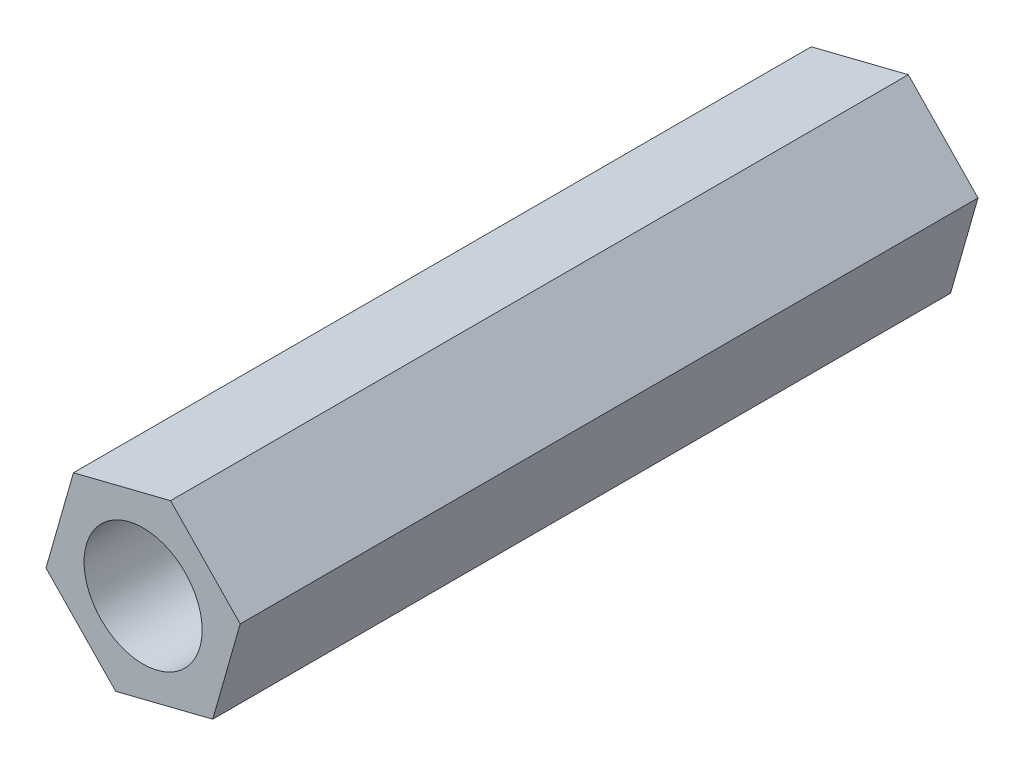
ISO-10303-21;
HEADER;
FILE_DESCRIPTION(('STEP AP214'),'2;1');
FILE_NAME('part.step','',(''),(''),'','','');
FILE_SCHEMA(('AUTOMOTIVE_DESIGN { 1 0 10303 214 1 1 1 1 }'));
ENDSEC;
DATA;
#1=APPLICATION_CONTEXT('core data for automotive mechanical design processes');
#2=APPLICATION_PROTOCOL_DEFINITION('international standard','automotive_design',2000,#1);
#3=PRODUCT_CONTEXT('',#1,'mechanical');
#4=PRODUCT('Part','Part','',(#3));
#5=PRODUCT_RELATED_PRODUCT_CATEGORY('part','',(#4));
#6=PRODUCT_DEFINITION_FORMATION('','',#4);
#7=PRODUCT_DEFINITION_CONTEXT('part definition',#1,'design');
#8=PRODUCT_DEFINITION('design','',#6,#7);
#9=PRODUCT_DEFINITION_SHAPE('','',#8);
#10=(LENGTH_UNIT() NAMED_UNIT(*) SI_UNIT(.MILLI.,.METRE.));
#11=(NAMED_UNIT(*) PLANE_ANGLE_UNIT() SI_UNIT($,.RADIAN.));
#12=(NAMED_UNIT(*) SI_UNIT($,.STERADIAN.) SOLID_ANGLE_UNIT());
#13=UNCERTAINTY_MEASURE_WITH_UNIT(LENGTH_MEASURE(1.E-05),#10,'distance_accuracy_value','');
#14=(GEOMETRIC_REPRESENTATION_CONTEXT(3) GLOBAL_UNCERTAINTY_ASSIGNED_CONTEXT((#13)) GLOBAL_UNIT_ASSIGNED_CONTEXT((#10,
#11,#12)) REPRESENTATION_CONTEXT('',''));
#15=CARTESIAN_POINT('',(0.,0.,0.));
#16=DIRECTION('',(0.,0.,1.));
#17=DIRECTION('',(1.,0.,0.));
#18=AXIS2_PLACEMENT_3D('',#15,#16,#17);
#19=CARTESIAN_POINT('',(0.,0.,20.));
#20=DIRECTION('',(0.,0.,1.));
#21=DIRECTION('',(1.,0.,0.));
#22=AXIS2_PLACEMENT_3D('',#19,#20,#21);
#23=PLANE('',#22);
#24=DIRECTION('',(0.969936568175344,0.243357871695649,0.));
#25=VECTOR('',#24,1.);
#26=CARTESIAN_POINT('',(-0.744092877537531,-2.60953235713437,20.));
#27=LINE('',#26,#25);
#28=CARTESIAN_POINT('',(-0.744092877537531,-2.60953235713437,20.));
#29=VERTEX_POINT('',#28);
#30=CARTESIAN_POINT('',(1.88787487450708,-1.94916951328975,20.));
#31=VERTEX_POINT('',#30);
#32=EDGE_CURVE('E129',#29,#31,#27,.T.);
#33=ORIENTED_EDGE('',*,*,#32,.T.);
#34=DIRECTION('',(0.274214184988325,0.96166864394717,0.));
#35=VECTOR('',#34,1.);
#36=CARTESIAN_POINT('',(1.88787487450708,-1.94916951328975,20.));
#37=LINE('',#36,#35);
#38=CARTESIAN_POINT('',(2.63196775204461,0.660362843844619,20.));
#39=VERTEX_POINT('',#38);
#40=EDGE_CURVE('E87',#31,#39,#37,.T.);
#41=ORIENTED_EDGE('',*,*,#40,.T.);
#42=DIRECTION('',(-0.695722383187018,0.71831077225152,0.));
#43=VECTOR('',#42,1.);
#44=CARTESIAN_POINT('',(2.63196775204461,0.660362843844619,20.));
#45=LINE('',#44,#43);
#46=CARTESIAN_POINT('',(0.744092877537532,2.60953235713437,20.));
#47=VERTEX_POINT('',#46);
#48=EDGE_CURVE('E100',#39,#47,#45,.T.);
#49=ORIENTED_EDGE('',*,*,#48,.T.);
#50=DIRECTION('',(-0.969936568175344,-0.243357871695649,0.));
#51=VECTOR('',#50,1.);
#52=CARTESIAN_POINT('',(0.744092877537532,2.60953235713437,20.));
#53=LINE('',#52,#51);
#54=CARTESIAN_POINT('',(-1.88787487450708,1.94916951328975,20.));
#55=VERTEX_POINT('',#54);
#56=EDGE_CURVE('E94',#47,#55,#53,.T.);
#57=ORIENTED_EDGE('',*,*,#56,.T.);
#58=DIRECTION('',(-0.274214184988326,-0.96166864394717,0.));
#59=VECTOR('',#58,1.);
#60=CARTESIAN_POINT('',(-1.88787487450708,1.94916951328975,20.));
#61=LINE('',#60,#59);
#62=CARTESIAN_POINT('',(-2.63196775204461,-0.660362843844618,20.));
#63=VERTEX_POINT('',#62);
#64=EDGE_CURVE('E98',#55,#63,#61,.T.);
#65=ORIENTED_EDGE('',*,*,#64,.T.);
#66=DIRECTION('',(0.695722383187018,-0.718310772251521,0.));
#67=VECTOR('',#66,1.);
#68=CARTESIAN_POINT('',(-2.63196775204461,-0.660362843844618,20.));
#69=LINE('',#68,#67);
#70=EDGE_CURVE('E50',#63,#29,#69,.T.);
#71=ORIENTED_EDGE('',*,*,#70,.T.);
#72=EDGE_LOOP('',(#33,#41,#49,#57,#65,#71));
#73=FACE_BOUND('',#72,.T.);
#74=CARTESIAN_POINT('',(0.,0.,20.));
#75=DIRECTION('',(0.,0.,1.));
#76=DIRECTION('',(1.,0.,0.));
#77=AXIS2_PLACEMENT_3D('',#74,#75,#76);
#78=CIRCLE('',#77,1.6);
#79=CARTESIAN_POINT('',(1.6,0.,20.));
#80=VERTEX_POINT('',#79);
#81=EDGE_CURVE('E122',#80,#80,#78,.T.);
#82=ORIENTED_EDGE('',*,*,#81,.F.);
#83=EDGE_LOOP('',(#82));
#84=FACE_BOUND('',#83,.T.);
#85=ADVANCED_FACE('F33',(#73,#84),#23,.T.);
#86=CARTESIAN_POINT('',(0.,0.,0.));
#87=DIRECTION('',(0.,0.,1.));
#88=DIRECTION('',(1.,0.,0.));
#89=AXIS2_PLACEMENT_3D('',#86,#87,#88);
#90=PLANE('',#89);
#91=DIRECTION('',(0.969936568175344,0.243357871695649,0.));
#92=VECTOR('',#91,1.);
#93=CARTESIAN_POINT('',(-0.744092877537531,-2.60953235713437,0.));
#94=LINE('',#93,#92);
#95=CARTESIAN_POINT('',(-0.744092877537531,-2.60953235713437,0.));
#96=VERTEX_POINT('',#95);
#97=CARTESIAN_POINT('',(1.88787487450708,-1.94916951328975,0.));
#98=VERTEX_POINT('',#97);
#99=EDGE_CURVE('E118',#96,#98,#94,.T.);
#100=ORIENTED_EDGE('',*,*,#99,.F.);
#101=DIRECTION('',(0.695722383187018,-0.718310772251521,0.));
#102=VECTOR('',#101,1.);
#103=CARTESIAN_POINT('',(-2.63196775204461,-0.660362843844618,0.));
#104=LINE('',#103,#102);
#105=CARTESIAN_POINT('',(-2.63196775204461,-0.660362843844618,0.));
#106=VERTEX_POINT('',#105);
#107=EDGE_CURVE('E79',#106,#96,#104,.T.);
#108=ORIENTED_EDGE('',*,*,#107,.F.);
#109=DIRECTION('',(-0.274214184988326,-0.96166864394717,0.));
#110=VECTOR('',#109,1.);
#111=CARTESIAN_POINT('',(-1.88787487450708,1.94916951328975,0.));
#112=LINE('',#111,#110);
#113=CARTESIAN_POINT('',(-1.88787487450708,1.94916951328975,0.));
#114=VERTEX_POINT('',#113);
#115=EDGE_CURVE('E73',#114,#106,#112,.T.);
#116=ORIENTED_EDGE('',*,*,#115,.F.);
#117=DIRECTION('',(-0.969936568175344,-0.243357871695649,0.));
#118=VECTOR('',#117,1.);
#119=CARTESIAN_POINT('',(0.744092877537532,2.60953235713437,0.));
#120=LINE('',#119,#118);
#121=CARTESIAN_POINT('',(0.744092877537532,2.60953235713437,0.));
#122=VERTEX_POINT('',#121);
#123=EDGE_CURVE('E108',#122,#114,#120,.T.);
#124=ORIENTED_EDGE('',*,*,#123,.F.);
#125=DIRECTION('',(-0.695722383187018,0.71831077225152,0.));
#126=VECTOR('',#125,1.);
#127=CARTESIAN_POINT('',(2.63196775204461,0.660362843844619,0.));
#128=LINE('',#127,#126);
#129=CARTESIAN_POINT('',(2.63196775204461,0.660362843844619,0.));
#130=VERTEX_POINT('',#129);
#131=EDGE_CURVE('E124',#130,#122,#128,.T.);
#132=ORIENTED_EDGE('',*,*,#131,.F.);
#133=DIRECTION('',(0.274214184988325,0.96166864394717,0.));
#134=VECTOR('',#133,1.);
#135=CARTESIAN_POINT('',(1.88787487450708,-1.94916951328975,0.));
#136=LINE('',#135,#134);
#137=EDGE_CURVE('E121',#98,#130,#136,.T.);
#138=ORIENTED_EDGE('',*,*,#137,.F.);
#139=EDGE_LOOP('',(#100,#108,#116,#124,#132,#138));
#140=FACE_BOUND('',#139,.T.);
#141=CARTESIAN_POINT('',(0.,0.,0.));
#142=DIRECTION('',(0.,0.,1.));
#143=DIRECTION('',(1.,0.,0.));
#144=AXIS2_PLACEMENT_3D('',#141,#142,#143);
#145=CIRCLE('',#144,1.6);
#146=CARTESIAN_POINT('',(1.6,0.,0.));
#147=VERTEX_POINT('',#146);
#148=EDGE_CURVE('E222',#147,#147,#145,.T.);
#149=ORIENTED_EDGE('',*,*,#148,.T.);
#150=EDGE_LOOP('',(#149));
#151=FACE_BOUND('',#150,.T.);
#152=ADVANCED_FACE('F138',(#140,#151),#90,.F.);
#153=CARTESIAN_POINT('',(-0.744092877537531,-2.60953235713437,20.));
#154=DIRECTION('',(-0.243357871695649,0.969936568175344,0.));
#155=DIRECTION('',(-0.969936568175344,-0.243357871695649,0.));
#156=AXIS2_PLACEMENT_3D('',#153,#154,#155);
#157=PLANE('',#156);
#158=ORIENTED_EDGE('',*,*,#99,.T.);
#159=DIRECTION('',(0.,0.,-1.));
#160=VECTOR('',#159,1.);
#161=CARTESIAN_POINT('',(1.88787487450708,-1.94916951328975,20.));
#162=LINE('',#161,#160);
#163=EDGE_CURVE('E11',#31,#98,#162,.T.);
#164=ORIENTED_EDGE('',*,*,#163,.F.);
#165=ORIENTED_EDGE('',*,*,#32,.F.);
#166=DIRECTION('',(0.,0.,-1.));
#167=VECTOR('',#166,1.);
#168=CARTESIAN_POINT('',(-0.744092877537531,-2.60953235713437,20.));
#169=LINE('',#168,#167);
#170=EDGE_CURVE('E114',#29,#96,#169,.T.);
#171=ORIENTED_EDGE('',*,*,#170,.T.);
#172=EDGE_LOOP('',(#158,#164,#165,#171));
#173=FACE_BOUND('',#172,.T.);
#174=ADVANCED_FACE('F35',(#173),#157,.F.);
#175=CARTESIAN_POINT('',(1.88787487450708,-1.94916951328975,20.));
#176=DIRECTION('',(-0.96166864394717,0.274214184988325,0.));
#177=DIRECTION('',(-0.274214184988325,-0.96166864394717,0.));
#178=AXIS2_PLACEMENT_3D('',#175,#176,#177);
#179=PLANE('',#178);
#180=ORIENTED_EDGE('',*,*,#137,.T.);
#181=DIRECTION('',(0.,0.,-1.));
#182=VECTOR('',#181,1.);
#183=CARTESIAN_POINT('',(2.63196775204461,0.660362843844619,20.));
#184=LINE('',#183,#182);
#185=EDGE_CURVE('E42',#39,#130,#184,.T.);
#186=ORIENTED_EDGE('',*,*,#185,.F.);
#187=ORIENTED_EDGE('',*,*,#40,.F.);
#188=ORIENTED_EDGE('',*,*,#163,.T.);
#189=EDGE_LOOP('',(#180,#186,#187,#188));
#190=FACE_BOUND('',#189,.T.);
#191=ADVANCED_FACE('F163',(#190),#179,.F.);
#192=CARTESIAN_POINT('',(2.63196775204461,0.660362843844619,20.));
#193=DIRECTION('',(-0.71831077225152,-0.695722383187018,0.));
#194=DIRECTION('',(0.695722383187018,-0.718310772251521,0.));
#195=AXIS2_PLACEMENT_3D('',#192,#193,#194);
#196=PLANE('',#195);
#197=ORIENTED_EDGE('',*,*,#131,.T.);
#198=DIRECTION('',(0.,0.,-1.));
#199=VECTOR('',#198,1.);
#200=CARTESIAN_POINT('',(0.744092877537532,2.60953235713437,20.));
#201=LINE('',#200,#199);
#202=EDGE_CURVE('E109',#47,#122,#201,.T.);
#203=ORIENTED_EDGE('',*,*,#202,.F.);
#204=ORIENTED_EDGE('',*,*,#48,.F.);
#205=ORIENTED_EDGE('',*,*,#185,.T.);
#206=EDGE_LOOP('',(#197,#203,#204,#205));
#207=FACE_BOUND('',#206,.T.);
#208=ADVANCED_FACE('F135',(#207),#196,.F.);
#209=CARTESIAN_POINT('',(0.744092877537532,2.60953235713437,20.));
#210=DIRECTION('',(0.243357871695649,-0.969936568175344,0.));
#211=DIRECTION('',(0.969936568175344,0.243357871695649,0.));
#212=AXIS2_PLACEMENT_3D('',#209,#210,#211);
#213=PLANE('',#212);
#214=ORIENTED_EDGE('',*,*,#123,.T.);
#215=DIRECTION('',(0.,0.,-1.));
#216=VECTOR('',#215,1.);
#217=CARTESIAN_POINT('',(-1.88787487450708,1.94916951328975,20.));
#218=LINE('',#217,#216);
#219=EDGE_CURVE('E105',#55,#114,#218,.T.);
#220=ORIENTED_EDGE('',*,*,#219,.F.);
#221=ORIENTED_EDGE('',*,*,#56,.F.);
#222=ORIENTED_EDGE('',*,*,#202,.T.);
#223=EDGE_LOOP('',(#214,#220,#221,#222));
#224=FACE_BOUND('',#223,.T.);
#225=ADVANCED_FACE('F106',(#224),#213,.F.);
#226=CARTESIAN_POINT('',(-1.88787487450708,1.94916951328975,20.));
#227=DIRECTION('',(0.96166864394717,-0.274214184988326,0.));
#228=DIRECTION('',(0.274214184988326,0.96166864394717,0.));
#229=AXIS2_PLACEMENT_3D('',#226,#227,#228);
#230=PLANE('',#229);
#231=ORIENTED_EDGE('',*,*,#115,.T.);
#232=DIRECTION('',(0.,0.,-1.));
#233=VECTOR('',#232,1.);
#234=CARTESIAN_POINT('',(-2.63196775204461,-0.660362843844618,20.));
#235=LINE('',#234,#233);
#236=EDGE_CURVE('E110',#63,#106,#235,.T.);
#237=ORIENTED_EDGE('',*,*,#236,.F.);
#238=ORIENTED_EDGE('',*,*,#64,.F.);
#239=ORIENTED_EDGE('',*,*,#219,.T.);
#240=EDGE_LOOP('',(#231,#237,#238,#239));
#241=FACE_BOUND('',#240,.T.);
#242=ADVANCED_FACE('F112',(#241),#230,.F.);
#243=CARTESIAN_POINT('',(-2.63196775204461,-0.660362843844618,20.));
#244=DIRECTION('',(0.718310772251521,0.695722383187018,0.));
#245=DIRECTION('',(-0.695722383187018,0.718310772251521,0.));
#246=AXIS2_PLACEMENT_3D('',#243,#244,#245);
#247=PLANE('',#246);
#248=ORIENTED_EDGE('',*,*,#107,.T.);
#249=ORIENTED_EDGE('',*,*,#170,.F.);
#250=ORIENTED_EDGE('',*,*,#70,.F.);
#251=ORIENTED_EDGE('',*,*,#236,.T.);
#252=EDGE_LOOP('',(#248,#249,#250,#251));
#253=FACE_BOUND('',#252,.T.);
#254=ADVANCED_FACE('F143',(#253),#247,.F.);
#255=CARTESIAN_POINT('',(0.,0.,20.));
#256=DIRECTION('',(0.,0.,-1.));
#257=DIRECTION('',(-1.,0.,0.));
#258=AXIS2_PLACEMENT_3D('',#255,#256,#257);
#259=CYLINDRICAL_SURFACE('',#258,1.6);
#260=ORIENTED_EDGE('',*,*,#81,.T.);
#261=EDGE_LOOP('',(#260));
#262=FACE_BOUND('',#261,.T.);
#263=ORIENTED_EDGE('',*,*,#148,.F.);
#264=EDGE_LOOP('',(#263));
#265=FACE_BOUND('',#264,.T.);
#266=ADVANCED_FACE('F145',(#262,#265),#259,.F.);
#267=CLOSED_SHELL('',(#85,#152,#174,#191,#208,#225,#242,#254,#266));
#268=MANIFOLD_SOLID_BREP('B2',#267);
#269=ADVANCED_BREP_SHAPE_REPRESENTATION('',(#18,#268),#14);
#270=SHAPE_DEFINITION_REPRESENTATION(#9,#269);
ENDSEC;
END-ISO-10303-21;
